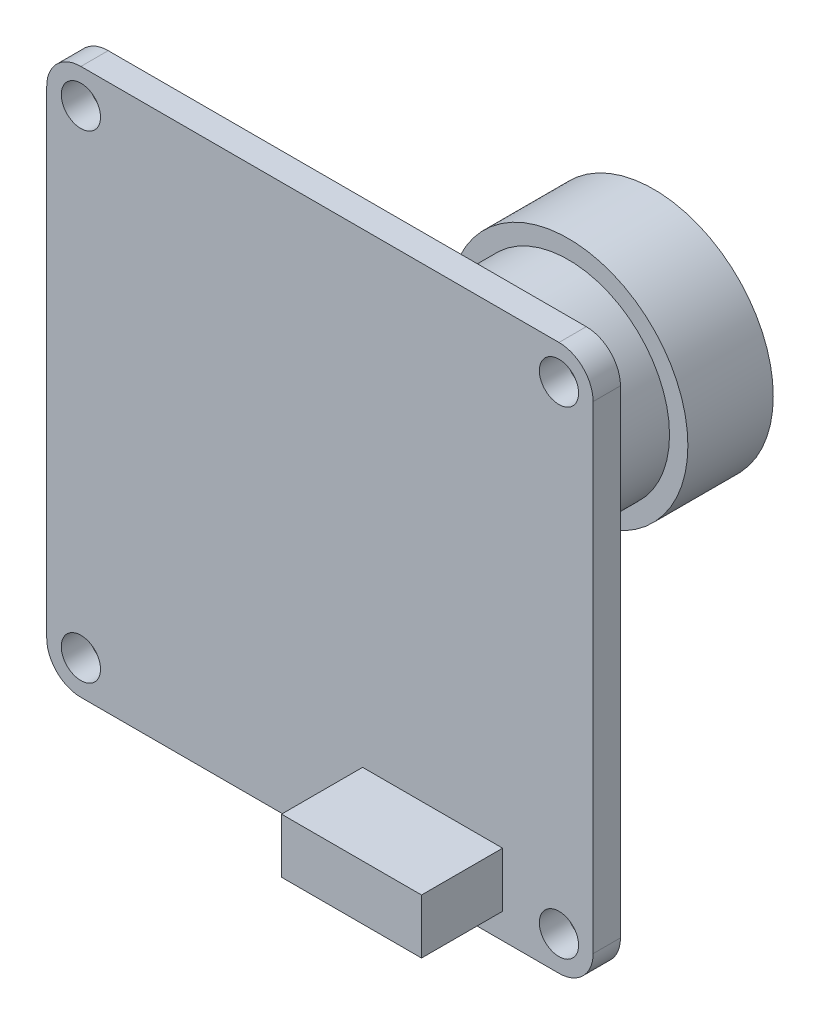
ISO-10303-21;
HEADER;
FILE_DESCRIPTION(('STEP AP214'),'2;1');
FILE_NAME('part.step','',(''),(''),'','','');
FILE_SCHEMA(('AUTOMOTIVE_DESIGN { 1 0 10303 214 1 1 1 1 }'));
ENDSEC;
DATA;
#1=APPLICATION_CONTEXT('core data for automotive mechanical design processes');
#2=APPLICATION_PROTOCOL_DEFINITION('international standard','automotive_design',2000,#1);
#3=PRODUCT_CONTEXT('',#1,'mechanical');
#4=PRODUCT('Part','Part','',(#3));
#5=PRODUCT_RELATED_PRODUCT_CATEGORY('part','',(#4));
#6=PRODUCT_DEFINITION_FORMATION('','',#4);
#7=PRODUCT_DEFINITION_CONTEXT('part definition',#1,'design');
#8=PRODUCT_DEFINITION('design','',#6,#7);
#9=PRODUCT_DEFINITION_SHAPE('','',#8);
#10=(LENGTH_UNIT() NAMED_UNIT(*) SI_UNIT(.MILLI.,.METRE.));
#11=(NAMED_UNIT(*) PLANE_ANGLE_UNIT() SI_UNIT($,.RADIAN.));
#12=(NAMED_UNIT(*) SI_UNIT($,.STERADIAN.) SOLID_ANGLE_UNIT());
#13=UNCERTAINTY_MEASURE_WITH_UNIT(LENGTH_MEASURE(1.E-05),#10,'distance_accuracy_value','');
#14=(GEOMETRIC_REPRESENTATION_CONTEXT(3) GLOBAL_UNCERTAINTY_ASSIGNED_CONTEXT((#13)) GLOBAL_UNIT_ASSIGNED_CONTEXT((#10,
#11,#12)) REPRESENTATION_CONTEXT('',''));
#15=CARTESIAN_POINT('',(0.,0.,0.));
#16=DIRECTION('',(0.,0.,1.));
#17=DIRECTION('',(1.,0.,0.));
#18=AXIS2_PLACEMENT_3D('',#15,#16,#17);
#19=CARTESIAN_POINT('',(0.,0.,1.6));
#20=DIRECTION('',(0.,0.,1.));
#21=DIRECTION('',(1.,0.,0.));
#22=AXIS2_PLACEMENT_3D('',#19,#20,#21);
#23=PLANE('',#22);
#24=CARTESIAN_POINT('',(-14.0000000000001,-13.9999999999999,1.6));
#25=DIRECTION('',(0.,0.,1.));
#26=DIRECTION('',(1.,0.,0.));
#27=AXIS2_PLACEMENT_3D('',#24,#25,#26);
#28=CIRCLE('',#27,1.15);
#29=CARTESIAN_POINT('',(-12.8500000000001,-13.9999999999999,1.6));
#30=VERTEX_POINT('',#29);
#31=EDGE_CURVE('E398',#30,#30,#28,.T.);
#32=ORIENTED_EDGE('',*,*,#31,.F.);
#33=EDGE_LOOP('',(#32));
#34=FACE_BOUND('',#33,.T.);
#35=CARTESIAN_POINT('',(13.9999999999999,-14.0000000000001,1.6));
#36=DIRECTION('',(0.,0.,1.));
#37=DIRECTION('',(1.,0.,0.));
#38=AXIS2_PLACEMENT_3D('',#35,#36,#37);
#39=CIRCLE('',#38,1.15);
#40=CARTESIAN_POINT('',(15.1499999999999,-14.0000000000001,1.6));
#41=VERTEX_POINT('',#40);
#42=EDGE_CURVE('E402',#41,#41,#39,.T.);
#43=ORIENTED_EDGE('',*,*,#42,.F.);
#44=EDGE_LOOP('',(#43));
#45=FACE_BOUND('',#44,.T.);
#46=CARTESIAN_POINT('',(14.,14.,1.6));
#47=DIRECTION('',(0.,0.,1.));
#48=DIRECTION('',(1.,0.,0.));
#49=AXIS2_PLACEMENT_3D('',#46,#47,#48);
#50=CIRCLE('',#49,1.15);
#51=CARTESIAN_POINT('',(15.1500000000001,14.,1.6));
#52=VERTEX_POINT('',#51);
#53=EDGE_CURVE('E407',#52,#52,#50,.T.);
#54=ORIENTED_EDGE('',*,*,#53,.F.);
#55=EDGE_LOOP('',(#54));
#56=FACE_BOUND('',#55,.T.);
#57=CARTESIAN_POINT('',(-14.,14.,1.6));
#58=DIRECTION('',(0.,0.,1.));
#59=DIRECTION('',(1.,0.,0.));
#60=AXIS2_PLACEMENT_3D('',#57,#58,#59);
#61=CIRCLE('',#60,1.15);
#62=CARTESIAN_POINT('',(-12.85,14.,1.6));
#63=VERTEX_POINT('',#62);
#64=EDGE_CURVE('E411',#63,#63,#61,.T.);
#65=ORIENTED_EDGE('',*,*,#64,.F.);
#66=EDGE_LOOP('',(#65));
#67=FACE_BOUND('',#66,.T.);
#68=DIRECTION('',(0.,1.,0.));
#69=VECTOR('',#68,1.);
#70=CARTESIAN_POINT('',(16.,0.,1.6));
#71=LINE('',#70,#69);
#72=CARTESIAN_POINT('',(16.,-14.,1.6));
#73=VERTEX_POINT('',#72);
#74=CARTESIAN_POINT('',(16.,14.,1.6));
#75=VERTEX_POINT('',#74);
#76=EDGE_CURVE('E423',#73,#75,#71,.T.);
#77=ORIENTED_EDGE('',*,*,#76,.T.);
#78=CARTESIAN_POINT('',(14.,14.,1.6));
#79=DIRECTION('',(0.,0.,1.));
#80=DIRECTION('',(1.,0.,0.));
#81=AXIS2_PLACEMENT_3D('',#78,#79,#80);
#82=CIRCLE('',#81,2.);
#83=CARTESIAN_POINT('',(14.,16.,1.6));
#84=VERTEX_POINT('',#83);
#85=EDGE_CURVE('E496',#75,#84,#82,.T.);
#86=ORIENTED_EDGE('',*,*,#85,.T.);
#87=DIRECTION('',(-1.,0.,0.));
#88=VECTOR('',#87,1.);
#89=CARTESIAN_POINT('',(0.,16.,1.6));
#90=LINE('',#89,#88);
#91=CARTESIAN_POINT('',(-14.,16.,1.6));
#92=VERTEX_POINT('',#91);
#93=EDGE_CURVE('E427',#84,#92,#90,.T.);
#94=ORIENTED_EDGE('',*,*,#93,.T.);
#95=CARTESIAN_POINT('',(-14.,14.,1.6));
#96=DIRECTION('',(0.,0.,1.));
#97=DIRECTION('',(1.,0.,0.));
#98=AXIS2_PLACEMENT_3D('',#95,#96,#97);
#99=CIRCLE('',#98,2.);
#100=CARTESIAN_POINT('',(-16.,14.,1.6));
#101=VERTEX_POINT('',#100);
#102=EDGE_CURVE('E487',#92,#101,#99,.T.);
#103=ORIENTED_EDGE('',*,*,#102,.T.);
#104=DIRECTION('',(0.,1.,0.));
#105=VECTOR('',#104,1.);
#106=CARTESIAN_POINT('',(-16.,0.,1.6));
#107=LINE('',#106,#105);
#108=CARTESIAN_POINT('',(-16.,-14.,1.6));
#109=VERTEX_POINT('',#108);
#110=EDGE_CURVE('E415',#109,#101,#107,.T.);
#111=ORIENTED_EDGE('',*,*,#110,.F.);
#112=CARTESIAN_POINT('',(-14.,-14.,1.6));
#113=DIRECTION('',(0.,0.,1.));
#114=DIRECTION('',(1.,0.,0.));
#115=AXIS2_PLACEMENT_3D('',#112,#113,#114);
#116=CIRCLE('',#115,2.);
#117=CARTESIAN_POINT('',(-14.,-16.,1.6));
#118=VERTEX_POINT('',#117);
#119=EDGE_CURVE('E490',#109,#118,#116,.T.);
#120=ORIENTED_EDGE('',*,*,#119,.T.);
#121=DIRECTION('',(-1.,0.,0.));
#122=VECTOR('',#121,1.);
#123=CARTESIAN_POINT('',(0.,-16.,1.6));
#124=LINE('',#123,#122);
#125=CARTESIAN_POINT('',(14.,-16.,1.6));
#126=VERTEX_POINT('',#125);
#127=EDGE_CURVE('E419',#126,#118,#124,.T.);
#128=ORIENTED_EDGE('',*,*,#127,.F.);
#129=CARTESIAN_POINT('',(14.,-14.,1.6));
#130=DIRECTION('',(0.,0.,1.));
#131=DIRECTION('',(1.,0.,0.));
#132=AXIS2_PLACEMENT_3D('',#129,#130,#131);
#133=CIRCLE('',#132,2.);
#134=EDGE_CURVE('E493',#126,#73,#133,.T.);
#135=ORIENTED_EDGE('',*,*,#134,.T.);
#136=EDGE_LOOP('',(#77,#86,#94,#103,#111,#120,#128,#135));
#137=FACE_BOUND('',#136,.T.);
#138=DIRECTION('',(-1.,0.,0.));
#139=VECTOR('',#138,1.);
#140=CARTESIAN_POINT('',(10.7,-11.3,1.6));
#141=LINE('',#140,#139);
#142=CARTESIAN_POINT('',(10.7,-11.3,1.6));
#143=VERTEX_POINT('',#142);
#144=CARTESIAN_POINT('',(2.5,-11.3,1.6));
#145=VERTEX_POINT('',#144);
#146=EDGE_CURVE('E981',#143,#145,#141,.T.);
#147=ORIENTED_EDGE('',*,*,#146,.F.);
#148=DIRECTION('',(0.,1.,0.));
#149=VECTOR('',#148,1.);
#150=CARTESIAN_POINT('',(10.7,-14.5,1.6));
#151=LINE('',#150,#149);
#152=CARTESIAN_POINT('',(10.7,-14.5,1.6));
#153=VERTEX_POINT('',#152);
#154=EDGE_CURVE('E238',#153,#143,#151,.T.);
#155=ORIENTED_EDGE('',*,*,#154,.F.);
#156=DIRECTION('',(1.,0.,0.));
#157=VECTOR('',#156,1.);
#158=CARTESIAN_POINT('',(10.7,-14.5,1.6));
#159=LINE('',#158,#157);
#160=CARTESIAN_POINT('',(2.5,-14.5,1.6));
#161=VERTEX_POINT('',#160);
#162=EDGE_CURVE('E234',#161,#153,#159,.T.);
#163=ORIENTED_EDGE('',*,*,#162,.F.);
#164=DIRECTION('',(0.,-1.,0.));
#165=VECTOR('',#164,1.);
#166=CARTESIAN_POINT('',(2.5,-14.5,1.6));
#167=LINE('',#166,#165);
#168=EDGE_CURVE('E977',#145,#161,#167,.T.);
#169=ORIENTED_EDGE('',*,*,#168,.F.);
#170=EDGE_LOOP('',(#147,#155,#163,#169));
#171=FACE_BOUND('',#170,.T.);
#172=ADVANCED_FACE('F47',(#34,#45,#56,#67,#137,#171),#23,.T.);
#173=CARTESIAN_POINT('',(0.,0.,-4.));
#174=DIRECTION('',(0.,0.,1.));
#175=DIRECTION('',(1.,0.,0.));
#176=AXIS2_PLACEMENT_3D('',#173,#174,#175);
#177=PLANE('',#176);
#178=DIRECTION('',(-1.,0.,0.));
#179=VECTOR('',#178,1.);
#180=CARTESIAN_POINT('',(0.,6.5,-4.));
#181=LINE('',#180,#179);
#182=CARTESIAN_POINT('',(0.,6.5,-4.));
#183=VERTEX_POINT('',#182);
#184=CARTESIAN_POINT('',(-6.5,6.5,-4.));
#185=VERTEX_POINT('',#184);
#186=EDGE_CURVE('E271',#183,#185,#181,.T.);
#187=ORIENTED_EDGE('',*,*,#186,.F.);
#188=CARTESIAN_POINT('',(0.,0.,-4.));
#189=DIRECTION('',(0.,0.,1.));
#190=DIRECTION('',(1.,0.,0.));
#191=AXIS2_PLACEMENT_3D('',#188,#189,#190);
#192=CIRCLE('',#191,6.5);
#193=CARTESIAN_POINT('',(0.,-6.5,-4.));
#194=VERTEX_POINT('',#193);
#195=EDGE_CURVE('E11',#183,#194,#192,.T.);
#196=ORIENTED_EDGE('',*,*,#195,.T.);
#197=DIRECTION('',(-1.,0.,0.));
#198=VECTOR('',#197,1.);
#199=CARTESIAN_POINT('',(0.,-6.5,-4.));
#200=LINE('',#199,#198);
#201=CARTESIAN_POINT('',(-6.5,-6.5,-4.));
#202=VERTEX_POINT('',#201);
#203=EDGE_CURVE('E295',#194,#202,#200,.T.);
#204=ORIENTED_EDGE('',*,*,#203,.T.);
#205=DIRECTION('',(0.,1.,0.));
#206=VECTOR('',#205,1.);
#207=CARTESIAN_POINT('',(-6.5,0.,-4.));
#208=LINE('',#207,#206);
#209=CARTESIAN_POINT('',(-6.5,-2.,-4.));
#210=VERTEX_POINT('',#209);
#211=EDGE_CURVE('E292',#202,#210,#208,.T.);
#212=ORIENTED_EDGE('',*,*,#211,.T.);
#213=DIRECTION('',(-1.,0.,0.));
#214=VECTOR('',#213,1.);
#215=CARTESIAN_POINT('',(0.,-2.,-4.));
#216=LINE('',#215,#214);
#217=CARTESIAN_POINT('',(-9.,-2.,-4.));
#218=VERTEX_POINT('',#217);
#219=EDGE_CURVE('E289',#210,#218,#216,.T.);
#220=ORIENTED_EDGE('',*,*,#219,.T.);
#221=CARTESIAN_POINT('',(-9.,0.,-4.));
#222=DIRECTION('',(0.,0.,1.));
#223=DIRECTION('',(1.,0.,0.));
#224=AXIS2_PLACEMENT_3D('',#221,#222,#223);
#225=CIRCLE('',#224,2.);
#226=CARTESIAN_POINT('',(-9.,2.,-4.));
#227=VERTEX_POINT('',#226);
#228=EDGE_CURVE('E285',#227,#218,#225,.T.);
#229=ORIENTED_EDGE('',*,*,#228,.F.);
#230=DIRECTION('',(-1.,0.,0.));
#231=VECTOR('',#230,1.);
#232=CARTESIAN_POINT('',(0.,2.,-4.));
#233=LINE('',#232,#231);
#234=CARTESIAN_POINT('',(-6.5,2.,-4.));
#235=VERTEX_POINT('',#234);
#236=EDGE_CURVE('E281',#235,#227,#233,.T.);
#237=ORIENTED_EDGE('',*,*,#236,.F.);
#238=DIRECTION('',(0.,1.,0.));
#239=VECTOR('',#238,1.);
#240=CARTESIAN_POINT('',(-6.5,0.,-4.));
#241=LINE('',#240,#239);
#242=EDGE_CURVE('E277',#235,#185,#241,.T.);
#243=ORIENTED_EDGE('',*,*,#242,.T.);
#244=EDGE_LOOP('',(#187,#196,#204,#212,#220,#229,#237,#243));
#245=FACE_BOUND('',#244,.T.);
#246=ADVANCED_FACE('F524',(#245),#177,.F.);
#247=CARTESIAN_POINT('',(-16.,0.,1.6));
#248=DIRECTION('',(-1.,0.,0.));
#249=DIRECTION('',(0.,0.,1.));
#250=AXIS2_PLACEMENT_3D('',#247,#248,#249);
#251=PLANE('',#250);
#252=DIRECTION('',(0.,1.,0.));
#253=VECTOR('',#252,1.);
#254=CARTESIAN_POINT('',(-16.,0.,0.));
#255=LINE('',#254,#253);
#256=CARTESIAN_POINT('',(-16.,-14.,0.));
#257=VERTEX_POINT('',#256);
#258=CARTESIAN_POINT('',(-16.,14.,0.));
#259=VERTEX_POINT('',#258);
#260=EDGE_CURVE('E447',#257,#259,#255,.T.);
#261=ORIENTED_EDGE('',*,*,#260,.F.);
#262=DIRECTION('',(0.,0.,-1.));
#263=VECTOR('',#262,1.);
#264=CARTESIAN_POINT('',(-16.,-14.,1.6));
#265=LINE('',#264,#263);
#266=EDGE_CURVE('E509',#257,#109,#265,.F.);
#267=ORIENTED_EDGE('',*,*,#266,.T.);
#268=ORIENTED_EDGE('',*,*,#110,.T.);
#269=DIRECTION('',(0.,0.,-1.));
#270=VECTOR('',#269,1.);
#271=CARTESIAN_POINT('',(-16.,14.,0.));
#272=LINE('',#271,#270);
#273=EDGE_CURVE('E506',#101,#259,#272,.T.);
#274=ORIENTED_EDGE('',*,*,#273,.T.);
#275=EDGE_LOOP('',(#261,#267,#268,#274));
#276=FACE_BOUND('',#275,.T.);
#277=ADVANCED_FACE('F604',(#276),#251,.T.);
#278=CARTESIAN_POINT('',(0.,-16.,1.6));
#279=DIRECTION('',(0.,-1.,0.));
#280=DIRECTION('',(1.,0.,0.));
#281=AXIS2_PLACEMENT_3D('',#278,#279,#280);
#282=PLANE('',#281);
#283=DIRECTION('',(-1.,0.,0.));
#284=VECTOR('',#283,1.);
#285=CARTESIAN_POINT('',(0.,-16.,0.));
#286=LINE('',#285,#284);
#287=CARTESIAN_POINT('',(14.,-16.,0.));
#288=VERTEX_POINT('',#287);
#289=CARTESIAN_POINT('',(-14.,-16.,0.));
#290=VERTEX_POINT('',#289);
#291=EDGE_CURVE('E451',#288,#290,#286,.T.);
#292=ORIENTED_EDGE('',*,*,#291,.F.);
#293=DIRECTION('',(0.,0.,-1.));
#294=VECTOR('',#293,1.);
#295=CARTESIAN_POINT('',(14.,-16.,1.6));
#296=LINE('',#295,#294);
#297=EDGE_CURVE('E503',#288,#126,#296,.F.);
#298=ORIENTED_EDGE('',*,*,#297,.T.);
#299=ORIENTED_EDGE('',*,*,#127,.T.);
#300=DIRECTION('',(0.,0.,-1.));
#301=VECTOR('',#300,1.);
#302=CARTESIAN_POINT('',(-14.,-16.,1.6));
#303=LINE('',#302,#301);
#304=EDGE_CURVE('E499',#118,#290,#303,.T.);
#305=ORIENTED_EDGE('',*,*,#304,.T.);
#306=EDGE_LOOP('',(#292,#298,#299,#305));
#307=FACE_BOUND('',#306,.T.);
#308=ADVANCED_FACE('F610',(#307),#282,.T.);
#309=CARTESIAN_POINT('',(16.,0.,1.6));
#310=DIRECTION('',(-1.,0.,0.));
#311=DIRECTION('',(0.,0.,1.));
#312=AXIS2_PLACEMENT_3D('',#309,#310,#311);
#313=PLANE('',#312);
#314=DIRECTION('',(0.,1.,0.));
#315=VECTOR('',#314,1.);
#316=CARTESIAN_POINT('',(16.,0.,0.));
#317=LINE('',#316,#315);
#318=CARTESIAN_POINT('',(16.,-14.,0.));
#319=VERTEX_POINT('',#318);
#320=CARTESIAN_POINT('',(16.,14.,0.));
#321=VERTEX_POINT('',#320);
#322=EDGE_CURVE('E455',#319,#321,#317,.T.);
#323=ORIENTED_EDGE('',*,*,#322,.T.);
#324=DIRECTION('',(0.,0.,-1.));
#325=VECTOR('',#324,1.);
#326=CARTESIAN_POINT('',(16.,14.,1.6));
#327=LINE('',#326,#325);
#328=EDGE_CURVE('E484',#321,#75,#327,.F.);
#329=ORIENTED_EDGE('',*,*,#328,.T.);
#330=ORIENTED_EDGE('',*,*,#76,.F.);
#331=DIRECTION('',(0.,0.,-1.));
#332=VECTOR('',#331,1.);
#333=CARTESIAN_POINT('',(16.,-14.,0.));
#334=LINE('',#333,#332);
#335=EDGE_CURVE('E480',#73,#319,#334,.T.);
#336=ORIENTED_EDGE('',*,*,#335,.T.);
#337=EDGE_LOOP('',(#323,#329,#330,#336));
#338=FACE_BOUND('',#337,.T.);
#339=ADVANCED_FACE('F619',(#338),#313,.F.);
#340=CARTESIAN_POINT('',(-14.,14.,1.6));
#341=DIRECTION('',(0.,0.,-1.));
#342=DIRECTION('',(-1.,0.,0.));
#343=AXIS2_PLACEMENT_3D('',#340,#341,#342);
#344=CYLINDRICAL_SURFACE('',#343,1.15);
#345=ORIENTED_EDGE('',*,*,#64,.T.);
#346=EDGE_LOOP('',(#345));
#347=FACE_BOUND('',#346,.T.);
#348=CARTESIAN_POINT('',(-14.,14.,0.));
#349=DIRECTION('',(0.,0.,1.));
#350=DIRECTION('',(1.,0.,0.));
#351=AXIS2_PLACEMENT_3D('',#348,#349,#350);
#352=CIRCLE('',#351,1.15);
#353=CARTESIAN_POINT('',(-12.85,14.,0.));
#354=VERTEX_POINT('',#353);
#355=EDGE_CURVE('E443',#354,#354,#352,.T.);
#356=ORIENTED_EDGE('',*,*,#355,.F.);
#357=EDGE_LOOP('',(#356));
#358=FACE_BOUND('',#357,.T.);
#359=ADVANCED_FACE('F649',(#347,#358),#344,.F.);
#360=CARTESIAN_POINT('',(14.,14.,1.6));
#361=DIRECTION('',(0.,0.,-1.));
#362=DIRECTION('',(-1.,0.,0.));
#363=AXIS2_PLACEMENT_3D('',#360,#361,#362);
#364=CYLINDRICAL_SURFACE('',#363,1.15);
#365=ORIENTED_EDGE('',*,*,#53,.T.);
#366=EDGE_LOOP('',(#365));
#367=FACE_BOUND('',#366,.T.);
#368=CARTESIAN_POINT('',(14.,14.,0.));
#369=DIRECTION('',(0.,0.,1.));
#370=DIRECTION('',(1.,0.,0.));
#371=AXIS2_PLACEMENT_3D('',#368,#369,#370);
#372=CIRCLE('',#371,1.15);
#373=CARTESIAN_POINT('',(15.1500000000001,14.,0.));
#374=VERTEX_POINT('',#373);
#375=EDGE_CURVE('E439',#374,#374,#372,.T.);
#376=ORIENTED_EDGE('',*,*,#375,.F.);
#377=EDGE_LOOP('',(#376));
#378=FACE_BOUND('',#377,.T.);
#379=ADVANCED_FACE('F656',(#367,#378),#364,.F.);
#380=CARTESIAN_POINT('',(13.9999999999999,-14.0000000000001,1.6));
#381=DIRECTION('',(0.,0.,-1.));
#382=DIRECTION('',(-1.,0.,0.));
#383=AXIS2_PLACEMENT_3D('',#380,#381,#382);
#384=CYLINDRICAL_SURFACE('',#383,1.15);
#385=ORIENTED_EDGE('',*,*,#42,.T.);
#386=EDGE_LOOP('',(#385));
#387=FACE_BOUND('',#386,.T.);
#388=CARTESIAN_POINT('',(13.9999999999999,-14.0000000000001,0.));
#389=DIRECTION('',(0.,0.,1.));
#390=DIRECTION('',(1.,0.,0.));
#391=AXIS2_PLACEMENT_3D('',#388,#389,#390);
#392=CIRCLE('',#391,1.15);
#393=CARTESIAN_POINT('',(15.1499999999999,-14.0000000000001,0.));
#394=VERTEX_POINT('',#393);
#395=EDGE_CURVE('E435',#394,#394,#392,.T.);
#396=ORIENTED_EDGE('',*,*,#395,.F.);
#397=EDGE_LOOP('',(#396));
#398=FACE_BOUND('',#397,.T.);
#399=ADVANCED_FACE('F660',(#387,#398),#384,.F.);
#400=CARTESIAN_POINT('',(-14.0000000000001,-13.9999999999999,1.6));
#401=DIRECTION('',(0.,0.,-1.));
#402=DIRECTION('',(-1.,0.,0.));
#403=AXIS2_PLACEMENT_3D('',#400,#401,#402);
#404=CYLINDRICAL_SURFACE('',#403,1.15);
#405=ORIENTED_EDGE('',*,*,#31,.T.);
#406=EDGE_LOOP('',(#405));
#407=FACE_BOUND('',#406,.T.);
#408=CARTESIAN_POINT('',(-14.0000000000001,-13.9999999999999,0.));
#409=DIRECTION('',(0.,0.,1.));
#410=DIRECTION('',(1.,0.,0.));
#411=AXIS2_PLACEMENT_3D('',#408,#409,#410);
#412=CIRCLE('',#411,1.15);
#413=CARTESIAN_POINT('',(-12.8500000000001,-13.9999999999999,0.));
#414=VERTEX_POINT('',#413);
#415=EDGE_CURVE('E362',#414,#414,#412,.T.);
#416=ORIENTED_EDGE('',*,*,#415,.F.);
#417=EDGE_LOOP('',(#416));
#418=FACE_BOUND('',#417,.T.);
#419=ADVANCED_FACE('F646',(#407,#418),#404,.F.);
#420=CARTESIAN_POINT('',(0.,16.,1.6));
#421=DIRECTION('',(0.,-1.,0.));
#422=DIRECTION('',(1.,0.,0.));
#423=AXIS2_PLACEMENT_3D('',#420,#421,#422);
#424=PLANE('',#423);
#425=ORIENTED_EDGE('',*,*,#93,.F.);
#426=DIRECTION('',(0.,0.,-1.));
#427=VECTOR('',#426,1.);
#428=CARTESIAN_POINT('',(14.,16.,1.6));
#429=LINE('',#428,#427);
#430=CARTESIAN_POINT('',(14.,16.,0.));
#431=VERTEX_POINT('',#430);
#432=EDGE_CURVE('E464',#84,#431,#429,.T.);
#433=ORIENTED_EDGE('',*,*,#432,.T.);
#434=DIRECTION('',(-1.,0.,0.));
#435=VECTOR('',#434,1.);
#436=CARTESIAN_POINT('',(0.,16.,0.));
#437=LINE('',#436,#435);
#438=CARTESIAN_POINT('',(-14.,16.,0.));
#439=VERTEX_POINT('',#438);
#440=EDGE_CURVE('E403',#431,#439,#437,.T.);
#441=ORIENTED_EDGE('',*,*,#440,.T.);
#442=DIRECTION('',(0.,0.,-1.));
#443=VECTOR('',#442,1.);
#444=CARTESIAN_POINT('',(-14.,16.,1.6));
#445=LINE('',#444,#443);
#446=EDGE_CURVE('E431',#439,#92,#445,.F.);
#447=ORIENTED_EDGE('',*,*,#446,.T.);
#448=EDGE_LOOP('',(#425,#433,#441,#447));
#449=FACE_BOUND('',#448,.T.);
#450=ADVANCED_FACE('F582',(#449),#424,.F.);
#451=CARTESIAN_POINT('',(0.,0.,0.));
#452=DIRECTION('',(0.,0.,1.));
#453=DIRECTION('',(1.,0.,0.));
#454=AXIS2_PLACEMENT_3D('',#451,#452,#453);
#455=PLANE('',#454);
#456=DIRECTION('',(-1.,0.,0.));
#457=VECTOR('',#456,1.);
#458=CARTESIAN_POINT('',(0.,2.,0.));
#459=LINE('',#458,#457);
#460=CARTESIAN_POINT('',(9.,2.,0.));
#461=VERTEX_POINT('',#460);
#462=CARTESIAN_POINT('',(6.5,2.,0.));
#463=VERTEX_POINT('',#462);
#464=EDGE_CURVE('E272',#461,#463,#459,.T.);
#465=ORIENTED_EDGE('',*,*,#464,.T.);
#466=DIRECTION('',(0.,1.,0.));
#467=VECTOR('',#466,1.);
#468=CARTESIAN_POINT('',(6.5,0.,0.));
#469=LINE('',#468,#467);
#470=CARTESIAN_POINT('',(6.5,6.5,0.));
#471=VERTEX_POINT('',#470);
#472=EDGE_CURVE('E266',#463,#471,#469,.T.);
#473=ORIENTED_EDGE('',*,*,#472,.T.);
#474=DIRECTION('',(-1.,0.,0.));
#475=VECTOR('',#474,1.);
#476=CARTESIAN_POINT('',(0.,6.5,0.));
#477=LINE('',#476,#475);
#478=CARTESIAN_POINT('',(-6.5,6.5,0.));
#479=VERTEX_POINT('',#478);
#480=EDGE_CURVE('E319',#471,#479,#477,.T.);
#481=ORIENTED_EDGE('',*,*,#480,.T.);
#482=DIRECTION('',(0.,1.,0.));
#483=VECTOR('',#482,1.);
#484=CARTESIAN_POINT('',(-6.5,0.,0.));
#485=LINE('',#484,#483);
#486=CARTESIAN_POINT('',(-6.5,2.,0.));
#487=VERTEX_POINT('',#486);
#488=EDGE_CURVE('E322',#487,#479,#485,.T.);
#489=ORIENTED_EDGE('',*,*,#488,.F.);
#490=DIRECTION('',(-1.,0.,0.));
#491=VECTOR('',#490,1.);
#492=CARTESIAN_POINT('',(0.,2.,0.));
#493=LINE('',#492,#491);
#494=CARTESIAN_POINT('',(-9.,2.,0.));
#495=VERTEX_POINT('',#494);
#496=EDGE_CURVE('E326',#487,#495,#493,.T.);
#497=ORIENTED_EDGE('',*,*,#496,.T.);
#498=CARTESIAN_POINT('',(-9.,0.,0.));
#499=DIRECTION('',(0.,0.,1.));
#500=DIRECTION('',(1.,0.,0.));
#501=AXIS2_PLACEMENT_3D('',#498,#499,#500);
#502=CIRCLE('',#501,2.);
#503=CARTESIAN_POINT('',(-9.,-2.,0.));
#504=VERTEX_POINT('',#503);
#505=EDGE_CURVE('E330',#495,#504,#502,.T.);
#506=ORIENTED_EDGE('',*,*,#505,.T.);
#507=DIRECTION('',(-1.,0.,0.));
#508=VECTOR('',#507,1.);
#509=CARTESIAN_POINT('',(0.,-2.,0.));
#510=LINE('',#509,#508);
#511=CARTESIAN_POINT('',(-6.5,-2.,0.));
#512=VERTEX_POINT('',#511);
#513=EDGE_CURVE('E334',#512,#504,#510,.T.);
#514=ORIENTED_EDGE('',*,*,#513,.F.);
#515=DIRECTION('',(0.,1.,0.));
#516=VECTOR('',#515,1.);
#517=CARTESIAN_POINT('',(-6.5,0.,0.));
#518=LINE('',#517,#516);
#519=CARTESIAN_POINT('',(-6.5,-6.5,0.));
#520=VERTEX_POINT('',#519);
#521=EDGE_CURVE('E338',#520,#512,#518,.T.);
#522=ORIENTED_EDGE('',*,*,#521,.F.);
#523=DIRECTION('',(-1.,0.,0.));
#524=VECTOR('',#523,1.);
#525=CARTESIAN_POINT('',(0.,-6.5,0.));
#526=LINE('',#525,#524);
#527=CARTESIAN_POINT('',(6.5,-6.5,0.));
#528=VERTEX_POINT('',#527);
#529=EDGE_CURVE('E341',#528,#520,#526,.T.);
#530=ORIENTED_EDGE('',*,*,#529,.F.);
#531=DIRECTION('',(0.,1.,0.));
#532=VECTOR('',#531,1.);
#533=CARTESIAN_POINT('',(6.5,0.,0.));
#534=LINE('',#533,#532);
#535=CARTESIAN_POINT('',(6.5,-2.,0.));
#536=VERTEX_POINT('',#535);
#537=EDGE_CURVE('E344',#528,#536,#534,.T.);
#538=ORIENTED_EDGE('',*,*,#537,.T.);
#539=DIRECTION('',(-1.,0.,0.));
#540=VECTOR('',#539,1.);
#541=CARTESIAN_POINT('',(0.,-2.,0.));
#542=LINE('',#541,#540);
#543=CARTESIAN_POINT('',(9.,-2.,0.));
#544=VERTEX_POINT('',#543);
#545=EDGE_CURVE('E348',#544,#536,#542,.T.);
#546=ORIENTED_EDGE('',*,*,#545,.F.);
#547=CARTESIAN_POINT('',(9.,0.,0.));
#548=DIRECTION('',(0.,0.,1.));
#549=DIRECTION('',(1.,0.,0.));
#550=AXIS2_PLACEMENT_3D('',#547,#548,#549);
#551=CIRCLE('',#550,2.);
#552=EDGE_CURVE('E352',#544,#461,#551,.T.);
#553=ORIENTED_EDGE('',*,*,#552,.T.);
#554=EDGE_LOOP('',(#465,#473,#481,#489,#497,#506,#514,#522,#530,#538,#546,#553));
#555=FACE_BOUND('',#554,.T.);
#556=ORIENTED_EDGE('',*,*,#415,.T.);
#557=EDGE_LOOP('',(#556));
#558=FACE_BOUND('',#557,.T.);
#559=ORIENTED_EDGE('',*,*,#395,.T.);
#560=EDGE_LOOP('',(#559));
#561=FACE_BOUND('',#560,.T.);
#562=ORIENTED_EDGE('',*,*,#375,.T.);
#563=EDGE_LOOP('',(#562));
#564=FACE_BOUND('',#563,.T.);
#565=ORIENTED_EDGE('',*,*,#355,.T.);
#566=EDGE_LOOP('',(#565));
#567=FACE_BOUND('',#566,.T.);
#568=ORIENTED_EDGE('',*,*,#440,.F.);
#569=CARTESIAN_POINT('',(14.,14.,0.));
#570=DIRECTION('',(0.,0.,1.));
#571=DIRECTION('',(1.,0.,0.));
#572=AXIS2_PLACEMENT_3D('',#569,#570,#571);
#573=CIRCLE('',#572,2.);
#574=EDGE_CURVE('E477',#431,#321,#573,.F.);
#575=ORIENTED_EDGE('',*,*,#574,.T.);
#576=ORIENTED_EDGE('',*,*,#322,.F.);
#577=CARTESIAN_POINT('',(14.,-14.,0.));
#578=DIRECTION('',(0.,0.,1.));
#579=DIRECTION('',(1.,0.,0.));
#580=AXIS2_PLACEMENT_3D('',#577,#578,#579);
#581=CIRCLE('',#580,2.);
#582=EDGE_CURVE('E474',#319,#288,#581,.F.);
#583=ORIENTED_EDGE('',*,*,#582,.T.);
#584=ORIENTED_EDGE('',*,*,#291,.T.);
#585=CARTESIAN_POINT('',(-14.,-14.,0.));
#586=DIRECTION('',(0.,0.,1.));
#587=DIRECTION('',(1.,0.,0.));
#588=AXIS2_PLACEMENT_3D('',#585,#586,#587);
#589=CIRCLE('',#588,2.);
#590=EDGE_CURVE('E471',#290,#257,#589,.F.);
#591=ORIENTED_EDGE('',*,*,#590,.T.);
#592=ORIENTED_EDGE('',*,*,#260,.T.);
#593=CARTESIAN_POINT('',(-14.,14.,0.));
#594=DIRECTION('',(0.,0.,1.));
#595=DIRECTION('',(1.,0.,0.));
#596=AXIS2_PLACEMENT_3D('',#593,#594,#595);
#597=CIRCLE('',#596,2.);
#598=EDGE_CURVE('E468',#259,#439,#597,.F.);
#599=ORIENTED_EDGE('',*,*,#598,.T.);
#600=EDGE_LOOP('',(#568,#575,#576,#583,#584,#591,#592,#599));
#601=FACE_BOUND('',#600,.T.);
#602=ADVANCED_FACE('F578',(#555,#558,#561,#564,#567,#601),#455,.F.);
#603=CARTESIAN_POINT('',(14.,14.,1.6));
#604=DIRECTION('',(0.,0.,-1.));
#605=DIRECTION('',(-1.,0.,0.));
#606=AXIS2_PLACEMENT_3D('',#603,#604,#605);
#607=CYLINDRICAL_SURFACE('',#606,2.);
#608=ORIENTED_EDGE('',*,*,#85,.F.);
#609=ORIENTED_EDGE('',*,*,#328,.F.);
#610=ORIENTED_EDGE('',*,*,#574,.F.);
#611=ORIENTED_EDGE('',*,*,#432,.F.);
#612=EDGE_LOOP('',(#608,#609,#610,#611));
#613=FACE_BOUND('',#612,.T.);
#614=ADVANCED_FACE('F581',(#613),#607,.T.);
#615=CARTESIAN_POINT('',(14.,-14.,1.6));
#616=DIRECTION('',(0.,0.,1.));
#617=DIRECTION('',(1.,0.,0.));
#618=AXIS2_PLACEMENT_3D('',#615,#616,#617);
#619=CYLINDRICAL_SURFACE('',#618,2.);
#620=ORIENTED_EDGE('',*,*,#134,.F.);
#621=ORIENTED_EDGE('',*,*,#297,.F.);
#622=ORIENTED_EDGE('',*,*,#582,.F.);
#623=ORIENTED_EDGE('',*,*,#335,.F.);
#624=EDGE_LOOP('',(#620,#621,#622,#623));
#625=FACE_BOUND('',#624,.T.);
#626=ADVANCED_FACE('F617',(#625),#619,.T.);
#627=CARTESIAN_POINT('',(-14.,-14.,1.6));
#628=DIRECTION('',(0.,0.,-1.));
#629=DIRECTION('',(-1.,0.,0.));
#630=AXIS2_PLACEMENT_3D('',#627,#628,#629);
#631=CYLINDRICAL_SURFACE('',#630,2.);
#632=ORIENTED_EDGE('',*,*,#119,.F.);
#633=ORIENTED_EDGE('',*,*,#266,.F.);
#634=ORIENTED_EDGE('',*,*,#590,.F.);
#635=ORIENTED_EDGE('',*,*,#304,.F.);
#636=EDGE_LOOP('',(#632,#633,#634,#635));
#637=FACE_BOUND('',#636,.T.);
#638=ADVANCED_FACE('F608',(#637),#631,.T.);
#639=CARTESIAN_POINT('',(-14.,14.,1.6));
#640=DIRECTION('',(0.,0.,1.));
#641=DIRECTION('',(1.,0.,0.));
#642=AXIS2_PLACEMENT_3D('',#639,#640,#641);
#643=CYLINDRICAL_SURFACE('',#642,2.);
#644=ORIENTED_EDGE('',*,*,#102,.F.);
#645=ORIENTED_EDGE('',*,*,#446,.F.);
#646=ORIENTED_EDGE('',*,*,#598,.F.);
#647=ORIENTED_EDGE('',*,*,#273,.F.);
#648=EDGE_LOOP('',(#644,#645,#646,#647));
#649=FACE_BOUND('',#648,.T.);
#650=ADVANCED_FACE('F49',(#649),#643,.T.);
#651=CARTESIAN_POINT('',(6.5,0.,-4.));
#652=DIRECTION('',(1.,0.,0.));
#653=DIRECTION('',(0.,1.,0.));
#654=AXIS2_PLACEMENT_3D('',#651,#652,#653);
#655=PLANE('',#654);
#656=ORIENTED_EDGE('',*,*,#472,.F.);
#657=DIRECTION('',(0.,0.,1.));
#658=VECTOR('',#657,1.);
#659=CARTESIAN_POINT('',(6.5,2.,-4.));
#660=LINE('',#659,#658);
#661=CARTESIAN_POINT('',(6.5,2.,-4.));
#662=VERTEX_POINT('',#661);
#663=EDGE_CURVE('E359',#662,#463,#660,.T.);
#664=ORIENTED_EDGE('',*,*,#663,.F.);
#665=DIRECTION('',(0.,1.,0.));
#666=VECTOR('',#665,1.);
#667=CARTESIAN_POINT('',(6.5,0.,-4.));
#668=LINE('',#667,#666);
#669=CARTESIAN_POINT('',(6.5,6.5,-4.));
#670=VERTEX_POINT('',#669);
#671=EDGE_CURVE('E267',#662,#670,#668,.T.);
#672=ORIENTED_EDGE('',*,*,#671,.T.);
#673=DIRECTION('',(0.,0.,1.));
#674=VECTOR('',#673,1.);
#675=CARTESIAN_POINT('',(6.5,6.5,-4.));
#676=LINE('',#675,#674);
#677=EDGE_CURVE('E315',#670,#471,#676,.T.);
#678=ORIENTED_EDGE('',*,*,#677,.T.);
#679=EDGE_LOOP('',(#656,#664,#672,#678));
#680=FACE_BOUND('',#679,.T.);
#681=ADVANCED_FACE('F535',(#680),#655,.T.);
#682=CARTESIAN_POINT('',(0.,2.,-4.));
#683=DIRECTION('',(0.,1.,0.));
#684=DIRECTION('',(0.,0.,1.));
#685=AXIS2_PLACEMENT_3D('',#682,#683,#684);
#686=PLANE('',#685);
#687=ORIENTED_EDGE('',*,*,#464,.F.);
#688=DIRECTION('',(0.,0.,1.));
#689=VECTOR('',#688,1.);
#690=CARTESIAN_POINT('',(9.,2.,-4.));
#691=LINE('',#690,#689);
#692=CARTESIAN_POINT('',(9.,2.,-4.));
#693=VERTEX_POINT('',#692);
#694=EDGE_CURVE('E363',#693,#461,#691,.T.);
#695=ORIENTED_EDGE('',*,*,#694,.F.);
#696=DIRECTION('',(-1.,0.,0.));
#697=VECTOR('',#696,1.);
#698=CARTESIAN_POINT('',(0.,2.,-4.));
#699=LINE('',#698,#697);
#700=EDGE_CURVE('E311',#693,#662,#699,.T.);
#701=ORIENTED_EDGE('',*,*,#700,.T.);
#702=ORIENTED_EDGE('',*,*,#663,.T.);
#703=EDGE_LOOP('',(#687,#695,#701,#702));
#704=FACE_BOUND('',#703,.T.);
#705=ADVANCED_FACE('F540',(#704),#686,.T.);
#706=CARTESIAN_POINT('',(9.,0.,-4.));
#707=DIRECTION('',(0.,0.,1.));
#708=DIRECTION('',(1.,0.,0.));
#709=AXIS2_PLACEMENT_3D('',#706,#707,#708);
#710=CYLINDRICAL_SURFACE('',#709,2.);
#711=ORIENTED_EDGE('',*,*,#552,.F.);
#712=DIRECTION('',(0.,0.,1.));
#713=VECTOR('',#712,1.);
#714=CARTESIAN_POINT('',(9.,-2.,-4.));
#715=LINE('',#714,#713);
#716=CARTESIAN_POINT('',(9.,-2.,-4.));
#717=VERTEX_POINT('',#716);
#718=EDGE_CURVE('E366',#717,#544,#715,.T.);
#719=ORIENTED_EDGE('',*,*,#718,.F.);
#720=CARTESIAN_POINT('',(9.,0.,-4.));
#721=DIRECTION('',(0.,0.,1.));
#722=DIRECTION('',(1.,0.,0.));
#723=AXIS2_PLACEMENT_3D('',#720,#721,#722);
#724=CIRCLE('',#723,2.);
#725=EDGE_CURVE('E307',#717,#693,#724,.T.);
#726=ORIENTED_EDGE('',*,*,#725,.T.);
#727=ORIENTED_EDGE('',*,*,#694,.T.);
#728=EDGE_LOOP('',(#711,#719,#726,#727));
#729=FACE_BOUND('',#728,.T.);
#730=ADVANCED_FACE('F543',(#729),#710,.T.);
#731=CARTESIAN_POINT('',(0.,-2.,-4.));
#732=DIRECTION('',(0.,1.,0.));
#733=DIRECTION('',(0.,0.,1.));
#734=AXIS2_PLACEMENT_3D('',#731,#732,#733);
#735=PLANE('',#734);
#736=ORIENTED_EDGE('',*,*,#545,.T.);
#737=DIRECTION('',(0.,0.,1.));
#738=VECTOR('',#737,1.);
#739=CARTESIAN_POINT('',(6.5,-2.,-4.));
#740=LINE('',#739,#738);
#741=CARTESIAN_POINT('',(6.5,-2.,-4.));
#742=VERTEX_POINT('',#741);
#743=EDGE_CURVE('E369',#742,#536,#740,.T.);
#744=ORIENTED_EDGE('',*,*,#743,.F.);
#745=DIRECTION('',(-1.,0.,0.));
#746=VECTOR('',#745,1.);
#747=CARTESIAN_POINT('',(0.,-2.,-4.));
#748=LINE('',#747,#746);
#749=EDGE_CURVE('E304',#717,#742,#748,.T.);
#750=ORIENTED_EDGE('',*,*,#749,.F.);
#751=ORIENTED_EDGE('',*,*,#718,.T.);
#752=EDGE_LOOP('',(#736,#744,#750,#751));
#753=FACE_BOUND('',#752,.T.);
#754=ADVANCED_FACE('F547',(#753),#735,.F.);
#755=CARTESIAN_POINT('',(6.5,0.,-4.));
#756=DIRECTION('',(1.,0.,0.));
#757=DIRECTION('',(0.,1.,0.));
#758=AXIS2_PLACEMENT_3D('',#755,#756,#757);
#759=PLANE('',#758);
#760=ORIENTED_EDGE('',*,*,#537,.F.);
#761=DIRECTION('',(0.,0.,1.));
#762=VECTOR('',#761,1.);
#763=CARTESIAN_POINT('',(6.5,-6.5,-4.));
#764=LINE('',#763,#762);
#765=CARTESIAN_POINT('',(6.5,-6.5,-4.));
#766=VERTEX_POINT('',#765);
#767=EDGE_CURVE('E372',#766,#528,#764,.T.);
#768=ORIENTED_EDGE('',*,*,#767,.F.);
#769=DIRECTION('',(0.,1.,0.));
#770=VECTOR('',#769,1.);
#771=CARTESIAN_POINT('',(6.5,0.,-4.));
#772=LINE('',#771,#770);
#773=EDGE_CURVE('E300',#766,#742,#772,.T.);
#774=ORIENTED_EDGE('',*,*,#773,.T.);
#775=ORIENTED_EDGE('',*,*,#743,.T.);
#776=EDGE_LOOP('',(#760,#768,#774,#775));
#777=FACE_BOUND('',#776,.T.);
#778=ADVANCED_FACE('F551',(#777),#759,.T.);
#779=CARTESIAN_POINT('',(0.,-6.5,-4.));
#780=DIRECTION('',(0.,1.,0.));
#781=DIRECTION('',(-1.,0.,0.));
#782=AXIS2_PLACEMENT_3D('',#779,#780,#781);
#783=PLANE('',#782);
#784=ORIENTED_EDGE('',*,*,#203,.F.);
#785=EDGE_CURVE('E296',#766,#194,#200,.T.);
#786=ORIENTED_EDGE('',*,*,#785,.F.);
#787=ORIENTED_EDGE('',*,*,#767,.T.);
#788=ORIENTED_EDGE('',*,*,#529,.T.);
#789=DIRECTION('',(0.,0.,1.));
#790=VECTOR('',#789,1.);
#791=CARTESIAN_POINT('',(-6.5,-6.5,-4.));
#792=LINE('',#791,#790);
#793=EDGE_CURVE('E375',#202,#520,#792,.T.);
#794=ORIENTED_EDGE('',*,*,#793,.F.);
#795=EDGE_LOOP('',(#784,#786,#787,#788,#794));
#796=FACE_BOUND('',#795,.T.);
#797=ADVANCED_FACE('F554',(#796),#783,.F.);
#798=CARTESIAN_POINT('',(-6.5,0.,-4.));
#799=DIRECTION('',(1.,0.,0.));
#800=DIRECTION('',(0.,0.,-1.));
#801=AXIS2_PLACEMENT_3D('',#798,#799,#800);
#802=PLANE('',#801);
#803=ORIENTED_EDGE('',*,*,#521,.T.);
#804=DIRECTION('',(0.,0.,1.));
#805=VECTOR('',#804,1.);
#806=CARTESIAN_POINT('',(-6.5,-2.,-4.));
#807=LINE('',#806,#805);
#808=EDGE_CURVE('E379',#210,#512,#807,.T.);
#809=ORIENTED_EDGE('',*,*,#808,.F.);
#810=ORIENTED_EDGE('',*,*,#211,.F.);
#811=ORIENTED_EDGE('',*,*,#793,.T.);
#812=EDGE_LOOP('',(#803,#809,#810,#811));
#813=FACE_BOUND('',#812,.T.);
#814=ADVANCED_FACE('F563',(#813),#802,.F.);
#815=CARTESIAN_POINT('',(0.,-2.,-4.));
#816=DIRECTION('',(0.,1.,0.));
#817=DIRECTION('',(0.,0.,1.));
#818=AXIS2_PLACEMENT_3D('',#815,#816,#817);
#819=PLANE('',#818);
#820=ORIENTED_EDGE('',*,*,#513,.T.);
#821=DIRECTION('',(0.,0.,1.));
#822=VECTOR('',#821,1.);
#823=CARTESIAN_POINT('',(-9.,-2.,-4.));
#824=LINE('',#823,#822);
#825=EDGE_CURVE('E383',#218,#504,#824,.T.);
#826=ORIENTED_EDGE('',*,*,#825,.F.);
#827=ORIENTED_EDGE('',*,*,#219,.F.);
#828=ORIENTED_EDGE('',*,*,#808,.T.);
#829=EDGE_LOOP('',(#820,#826,#827,#828));
#830=FACE_BOUND('',#829,.T.);
#831=ADVANCED_FACE('F567',(#830),#819,.F.);
#832=CARTESIAN_POINT('',(-9.,0.,-4.));
#833=DIRECTION('',(0.,0.,1.));
#834=DIRECTION('',(1.,0.,0.));
#835=AXIS2_PLACEMENT_3D('',#832,#833,#834);
#836=CYLINDRICAL_SURFACE('',#835,2.);
#837=ORIENTED_EDGE('',*,*,#505,.F.);
#838=DIRECTION('',(0.,0.,1.));
#839=VECTOR('',#838,1.);
#840=CARTESIAN_POINT('',(-9.,2.,-4.));
#841=LINE('',#840,#839);
#842=EDGE_CURVE('E386',#227,#495,#841,.T.);
#843=ORIENTED_EDGE('',*,*,#842,.F.);
#844=ORIENTED_EDGE('',*,*,#228,.T.);
#845=ORIENTED_EDGE('',*,*,#825,.T.);
#846=EDGE_LOOP('',(#837,#843,#844,#845));
#847=FACE_BOUND('',#846,.T.);
#848=ADVANCED_FACE('F570',(#847),#836,.T.);
#849=CARTESIAN_POINT('',(0.,2.,-4.));
#850=DIRECTION('',(0.,1.,0.));
#851=DIRECTION('',(0.,0.,1.));
#852=AXIS2_PLACEMENT_3D('',#849,#850,#851);
#853=PLANE('',#852);
#854=ORIENTED_EDGE('',*,*,#496,.F.);
#855=DIRECTION('',(0.,0.,1.));
#856=VECTOR('',#855,1.);
#857=CARTESIAN_POINT('',(-6.5,2.,-4.));
#858=LINE('',#857,#856);
#859=EDGE_CURVE('E389',#235,#487,#858,.T.);
#860=ORIENTED_EDGE('',*,*,#859,.F.);
#861=ORIENTED_EDGE('',*,*,#236,.T.);
#862=ORIENTED_EDGE('',*,*,#842,.T.);
#863=EDGE_LOOP('',(#854,#860,#861,#862));
#864=FACE_BOUND('',#863,.T.);
#865=ADVANCED_FACE('F573',(#864),#853,.T.);
#866=CARTESIAN_POINT('',(-6.5,0.,-4.));
#867=DIRECTION('',(1.,0.,0.));
#868=DIRECTION('',(0.,0.,-1.));
#869=AXIS2_PLACEMENT_3D('',#866,#867,#868);
#870=PLANE('',#869);
#871=ORIENTED_EDGE('',*,*,#488,.T.);
#872=DIRECTION('',(0.,0.,1.));
#873=VECTOR('',#872,1.);
#874=CARTESIAN_POINT('',(-6.5,6.5,-4.));
#875=LINE('',#874,#873);
#876=EDGE_CURVE('E392',#185,#479,#875,.T.);
#877=ORIENTED_EDGE('',*,*,#876,.F.);
#878=ORIENTED_EDGE('',*,*,#242,.F.);
#879=ORIENTED_EDGE('',*,*,#859,.T.);
#880=EDGE_LOOP('',(#871,#877,#878,#879));
#881=FACE_BOUND('',#880,.T.);
#882=ADVANCED_FACE('F576',(#881),#870,.F.);
#883=CARTESIAN_POINT('',(0.,6.5,-4.));
#884=DIRECTION('',(0.,1.,0.));
#885=DIRECTION('',(-1.,0.,0.));
#886=AXIS2_PLACEMENT_3D('',#883,#884,#885);
#887=PLANE('',#886);
#888=ORIENTED_EDGE('',*,*,#876,.T.);
#889=ORIENTED_EDGE('',*,*,#480,.F.);
#890=ORIENTED_EDGE('',*,*,#677,.F.);
#891=EDGE_CURVE('E273',#670,#183,#181,.T.);
#892=ORIENTED_EDGE('',*,*,#891,.T.);
#893=ORIENTED_EDGE('',*,*,#186,.T.);
#894=EDGE_LOOP('',(#888,#889,#890,#892,#893));
#895=FACE_BOUND('',#894,.T.);
#896=ADVANCED_FACE('F531',(#895),#887,.T.);
#897=ORIENTED_EDGE('',*,*,#785,.T.);
#898=EDGE_CURVE('E51',#194,#183,#192,.T.);
#899=ORIENTED_EDGE('',*,*,#898,.T.);
#900=ORIENTED_EDGE('',*,*,#891,.F.);
#901=ORIENTED_EDGE('',*,*,#671,.F.);
#902=ORIENTED_EDGE('',*,*,#700,.F.);
#903=ORIENTED_EDGE('',*,*,#725,.F.);
#904=ORIENTED_EDGE('',*,*,#749,.T.);
#905=ORIENTED_EDGE('',*,*,#773,.F.);
#906=EDGE_LOOP('',(#897,#899,#900,#901,#902,#903,#904,#905));
#907=FACE_BOUND('',#906,.T.);
#908=ADVANCED_FACE('F519',(#907),#177,.F.);
#909=CARTESIAN_POINT('',(0.,0.,-7.75));
#910=DIRECTION('',(0.,0.,1.));
#911=DIRECTION('',(1.,0.,0.));
#912=AXIS2_PLACEMENT_3D('',#909,#910,#911);
#913=CYLINDRICAL_SURFACE('',#912,6.5);
#914=CARTESIAN_POINT('',(0.,0.,-7.75));
#915=DIRECTION('',(0.,0.,1.));
#916=DIRECTION('',(1.,0.,0.));
#917=AXIS2_PLACEMENT_3D('',#914,#915,#916);
#918=CIRCLE('',#917,6.5);
#919=CARTESIAN_POINT('',(6.5,0.,-7.75));
#920=VERTEX_POINT('',#919);
#921=EDGE_CURVE('E262',#920,#920,#918,.T.);
#922=ORIENTED_EDGE('',*,*,#921,.T.);
#923=EDGE_LOOP('',(#922));
#924=FACE_BOUND('',#923,.T.);
#925=ORIENTED_EDGE('',*,*,#195,.F.);
#926=ORIENTED_EDGE('',*,*,#898,.F.);
#927=EDGE_LOOP('',(#925,#926));
#928=FACE_BOUND('',#927,.T.);
#929=ADVANCED_FACE('F826',(#924,#928),#913,.T.);
#930=CARTESIAN_POINT('',(0.,0.,-7.75));
#931=DIRECTION('',(0.,0.,1.));
#932=DIRECTION('',(1.,0.,0.));
#933=AXIS2_PLACEMENT_3D('',#930,#931,#932);
#934=PLANE('',#933);
#935=CARTESIAN_POINT('',(0.,0.,-7.75));
#936=DIRECTION('',(0.,0.,1.));
#937=DIRECTION('',(1.,0.,0.));
#938=AXIS2_PLACEMENT_3D('',#935,#936,#937);
#939=CIRCLE('',#938,5.925);
#940=CARTESIAN_POINT('',(5.925,0.,-7.75));
#941=VERTEX_POINT('',#940);
#942=EDGE_CURVE('E241',#941,#941,#939,.T.);
#943=ORIENTED_EDGE('',*,*,#942,.T.);
#944=EDGE_LOOP('',(#943));
#945=FACE_BOUND('',#944,.T.);
#946=ORIENTED_EDGE('',*,*,#921,.F.);
#947=EDGE_LOOP('',(#946));
#948=FACE_BOUND('',#947,.T.);
#949=ADVANCED_FACE('F869',(#945,#948),#934,.F.);
#950=CARTESIAN_POINT('',(0.,0.,-17.95));
#951=DIRECTION('',(0.,0.,1.));
#952=DIRECTION('',(1.,0.,0.));
#953=AXIS2_PLACEMENT_3D('',#950,#951,#952);
#954=PLANE('',#953);
#955=CARTESIAN_POINT('',(0.,0.,-17.95));
#956=DIRECTION('',(0.,0.,1.));
#957=DIRECTION('',(1.,0.,0.));
#958=AXIS2_PLACEMENT_3D('',#955,#956,#957);
#959=CIRCLE('',#958,7.);
#960=CARTESIAN_POINT('',(7.,0.,-17.95));
#961=VERTEX_POINT('',#960);
#962=EDGE_CURVE('E258',#961,#961,#959,.T.);
#963=ORIENTED_EDGE('',*,*,#962,.F.);
#964=EDGE_LOOP('',(#963));
#965=FACE_BOUND('',#964,.T.);
#966=ADVANCED_FACE('F879',(#965),#954,.F.);
#967=CARTESIAN_POINT('',(0.,0.,0.));
#968=DIRECTION('',(0.,0.,1.));
#969=DIRECTION('',(1.,0.,0.));
#970=AXIS2_PLACEMENT_3D('',#967,#968,#969);
#971=CYLINDRICAL_SURFACE('',#970,7.);
#972=CARTESIAN_POINT('',(0.,0.,-12.95));
#973=DIRECTION('',(0.,0.,1.));
#974=DIRECTION('',(1.,0.,0.));
#975=AXIS2_PLACEMENT_3D('',#972,#973,#974);
#976=CIRCLE('',#975,7.);
#977=CARTESIAN_POINT('',(7.,0.,-12.95));
#978=VERTEX_POINT('',#977);
#979=EDGE_CURVE('E254',#978,#978,#976,.T.);
#980=ORIENTED_EDGE('',*,*,#979,.F.);
#981=EDGE_LOOP('',(#980));
#982=FACE_BOUND('',#981,.T.);
#983=ORIENTED_EDGE('',*,*,#962,.T.);
#984=EDGE_LOOP('',(#983));
#985=FACE_BOUND('',#984,.T.);
#986=ADVANCED_FACE('F895',(#982,#985),#971,.T.);
#987=CARTESIAN_POINT('',(0.,7.,-12.95));
#988=DIRECTION('',(0.,0.,-1.));
#989=DIRECTION('',(-1.,0.,0.));
#990=AXIS2_PLACEMENT_3D('',#987,#988,#989);
#991=PLANE('',#990);
#992=CARTESIAN_POINT('',(0.,0.,-12.95));
#993=DIRECTION('',(0.,0.,1.));
#994=DIRECTION('',(1.,0.,0.));
#995=AXIS2_PLACEMENT_3D('',#992,#993,#994);
#996=CIRCLE('',#995,5.925);
#997=CARTESIAN_POINT('',(5.925,0.,-12.95));
#998=VERTEX_POINT('',#997);
#999=EDGE_CURVE('E246',#998,#998,#996,.T.);
#1000=ORIENTED_EDGE('',*,*,#999,.F.);
#1001=EDGE_LOOP('',(#1000));
#1002=FACE_BOUND('',#1001,.T.);
#1003=ORIENTED_EDGE('',*,*,#979,.T.);
#1004=EDGE_LOOP('',(#1003));
#1005=FACE_BOUND('',#1004,.T.);
#1006=ADVANCED_FACE('F905',(#1002,#1005),#991,.F.);
#1007=CARTESIAN_POINT('',(0.,0.,0.));
#1008=DIRECTION('',(0.,0.,1.));
#1009=DIRECTION('',(1.,0.,0.));
#1010=AXIS2_PLACEMENT_3D('',#1007,#1008,#1009);
#1011=CYLINDRICAL_SURFACE('',#1010,5.925);
#1012=ORIENTED_EDGE('',*,*,#942,.F.);
#1013=EDGE_LOOP('',(#1012));
#1014=FACE_BOUND('',#1013,.T.);
#1015=ORIENTED_EDGE('',*,*,#999,.T.);
#1016=EDGE_LOOP('',(#1015));
#1017=FACE_BOUND('',#1016,.T.);
#1018=ADVANCED_FACE('F915',(#1014,#1017),#1011,.T.);
#1019=CARTESIAN_POINT('',(10.7,-14.5,6.35));
#1020=DIRECTION('',(-1.,0.,0.));
#1021=DIRECTION('',(0.,0.,1.));
#1022=AXIS2_PLACEMENT_3D('',#1019,#1020,#1021);
#1023=PLANE('',#1022);
#1024=ORIENTED_EDGE('',*,*,#154,.T.);
#1025=DIRECTION('',(0.,0.,-1.));
#1026=VECTOR('',#1025,1.);
#1027=CARTESIAN_POINT('',(10.7,-11.3,6.35));
#1028=LINE('',#1027,#1026);
#1029=CARTESIAN_POINT('',(10.7,-11.3,6.35));
#1030=VERTEX_POINT('',#1029);
#1031=EDGE_CURVE('E217',#1030,#143,#1028,.T.);
#1032=ORIENTED_EDGE('',*,*,#1031,.F.);
#1033=DIRECTION('',(0.,1.,0.));
#1034=VECTOR('',#1033,1.);
#1035=CARTESIAN_POINT('',(10.7,-14.5,6.35));
#1036=LINE('',#1035,#1034);
#1037=CARTESIAN_POINT('',(10.7,-14.5,6.35));
#1038=VERTEX_POINT('',#1037);
#1039=EDGE_CURVE('E225',#1038,#1030,#1036,.T.);
#1040=ORIENTED_EDGE('',*,*,#1039,.F.);
#1041=DIRECTION('',(0.,0.,-1.));
#1042=VECTOR('',#1041,1.);
#1043=CARTESIAN_POINT('',(10.7,-14.5,6.35));
#1044=LINE('',#1043,#1042);
#1045=EDGE_CURVE('E974',#1038,#153,#1044,.T.);
#1046=ORIENTED_EDGE('',*,*,#1045,.T.);
#1047=EDGE_LOOP('',(#1024,#1032,#1040,#1046));
#1048=FACE_BOUND('',#1047,.T.);
#1049=ADVANCED_FACE('F236',(#1048),#1023,.F.);
#1050=CARTESIAN_POINT('',(10.7,-11.3,6.35));
#1051=DIRECTION('',(0.,-1.,0.));
#1052=DIRECTION('',(1.,0.,0.));
#1053=AXIS2_PLACEMENT_3D('',#1050,#1051,#1052);
#1054=PLANE('',#1053);
#1055=ORIENTED_EDGE('',*,*,#146,.T.);
#1056=DIRECTION('',(0.,0.,-1.));
#1057=VECTOR('',#1056,1.);
#1058=CARTESIAN_POINT('',(2.5,-11.3,6.35));
#1059=LINE('',#1058,#1057);
#1060=CARTESIAN_POINT('',(2.5,-11.3,6.35));
#1061=VERTEX_POINT('',#1060);
#1062=EDGE_CURVE('E220',#1061,#145,#1059,.T.);
#1063=ORIENTED_EDGE('',*,*,#1062,.F.);
#1064=DIRECTION('',(-1.,0.,0.));
#1065=VECTOR('',#1064,1.);
#1066=CARTESIAN_POINT('',(10.7,-11.3,6.35));
#1067=LINE('',#1066,#1065);
#1068=EDGE_CURVE('E213',#1030,#1061,#1067,.T.);
#1069=ORIENTED_EDGE('',*,*,#1068,.F.);
#1070=ORIENTED_EDGE('',*,*,#1031,.T.);
#1071=EDGE_LOOP('',(#1055,#1063,#1069,#1070));
#1072=FACE_BOUND('',#1071,.T.);
#1073=ADVANCED_FACE('F215',(#1072),#1054,.F.);
#1074=CARTESIAN_POINT('',(2.5,-14.5,6.35));
#1075=DIRECTION('',(1.,0.,0.));
#1076=DIRECTION('',(0.,0.,-1.));
#1077=AXIS2_PLACEMENT_3D('',#1074,#1075,#1076);
#1078=PLANE('',#1077);
#1079=ORIENTED_EDGE('',*,*,#168,.T.);
#1080=DIRECTION('',(0.,0.,-1.));
#1081=VECTOR('',#1080,1.);
#1082=CARTESIAN_POINT('',(2.5,-14.5,6.35));
#1083=LINE('',#1082,#1081);
#1084=CARTESIAN_POINT('',(2.5,-14.5,6.35));
#1085=VERTEX_POINT('',#1084);
#1086=EDGE_CURVE('E63',#1085,#161,#1083,.T.);
#1087=ORIENTED_EDGE('',*,*,#1086,.F.);
#1088=DIRECTION('',(0.,-1.,0.));
#1089=VECTOR('',#1088,1.);
#1090=CARTESIAN_POINT('',(2.5,-14.5,6.35));
#1091=LINE('',#1090,#1089);
#1092=EDGE_CURVE('E224',#1061,#1085,#1091,.T.);
#1093=ORIENTED_EDGE('',*,*,#1092,.F.);
#1094=ORIENTED_EDGE('',*,*,#1062,.T.);
#1095=EDGE_LOOP('',(#1079,#1087,#1093,#1094));
#1096=FACE_BOUND('',#1095,.T.);
#1097=ADVANCED_FACE('F944',(#1096),#1078,.F.);
#1098=CARTESIAN_POINT('',(10.7,-14.5,6.35));
#1099=DIRECTION('',(0.,1.,0.));
#1100=DIRECTION('',(-1.,0.,0.));
#1101=AXIS2_PLACEMENT_3D('',#1098,#1099,#1100);
#1102=PLANE('',#1101);
#1103=ORIENTED_EDGE('',*,*,#162,.T.);
#1104=ORIENTED_EDGE('',*,*,#1045,.F.);
#1105=DIRECTION('',(1.,0.,0.));
#1106=VECTOR('',#1105,1.);
#1107=CARTESIAN_POINT('',(10.7,-14.5,6.35));
#1108=LINE('',#1107,#1106);
#1109=EDGE_CURVE('E229',#1085,#1038,#1108,.T.);
#1110=ORIENTED_EDGE('',*,*,#1109,.F.);
#1111=ORIENTED_EDGE('',*,*,#1086,.T.);
#1112=EDGE_LOOP('',(#1103,#1104,#1110,#1111));
#1113=FACE_BOUND('',#1112,.T.);
#1114=ADVANCED_FACE('F953',(#1113),#1102,.F.);
#1115=CARTESIAN_POINT('',(0.,0.,6.35));
#1116=DIRECTION('',(0.,0.,1.));
#1117=DIRECTION('',(1.,0.,0.));
#1118=AXIS2_PLACEMENT_3D('',#1115,#1116,#1117);
#1119=PLANE('',#1118);
#1120=ORIENTED_EDGE('',*,*,#1039,.T.);
#1121=ORIENTED_EDGE('',*,*,#1068,.T.);
#1122=ORIENTED_EDGE('',*,*,#1092,.T.);
#1123=ORIENTED_EDGE('',*,*,#1109,.T.);
#1124=EDGE_LOOP('',(#1120,#1121,#1122,#1123));
#1125=FACE_BOUND('',#1124,.T.);
#1126=ADVANCED_FACE('F228',(#1125),#1119,.T.);
#1127=CLOSED_SHELL('',(#172,#246,#277,#308,#339,#359,#379,#399,#419,#450,#602,#614,#626,#638,
#650,#681,#705,#730,#754,#778,#797,#814,#831,#848,#865,#882,#896,#908,#929,#949,#966,#986,#1006,
#1018,#1049,#1073,#1097,#1114,#1126));
#1128=MANIFOLD_SOLID_BREP('B2',#1127);
#1129=ADVANCED_BREP_SHAPE_REPRESENTATION('',(#18,#1128),#14);
#1130=SHAPE_DEFINITION_REPRESENTATION(#9,#1129);
ENDSEC;
END-ISO-10303-21;
